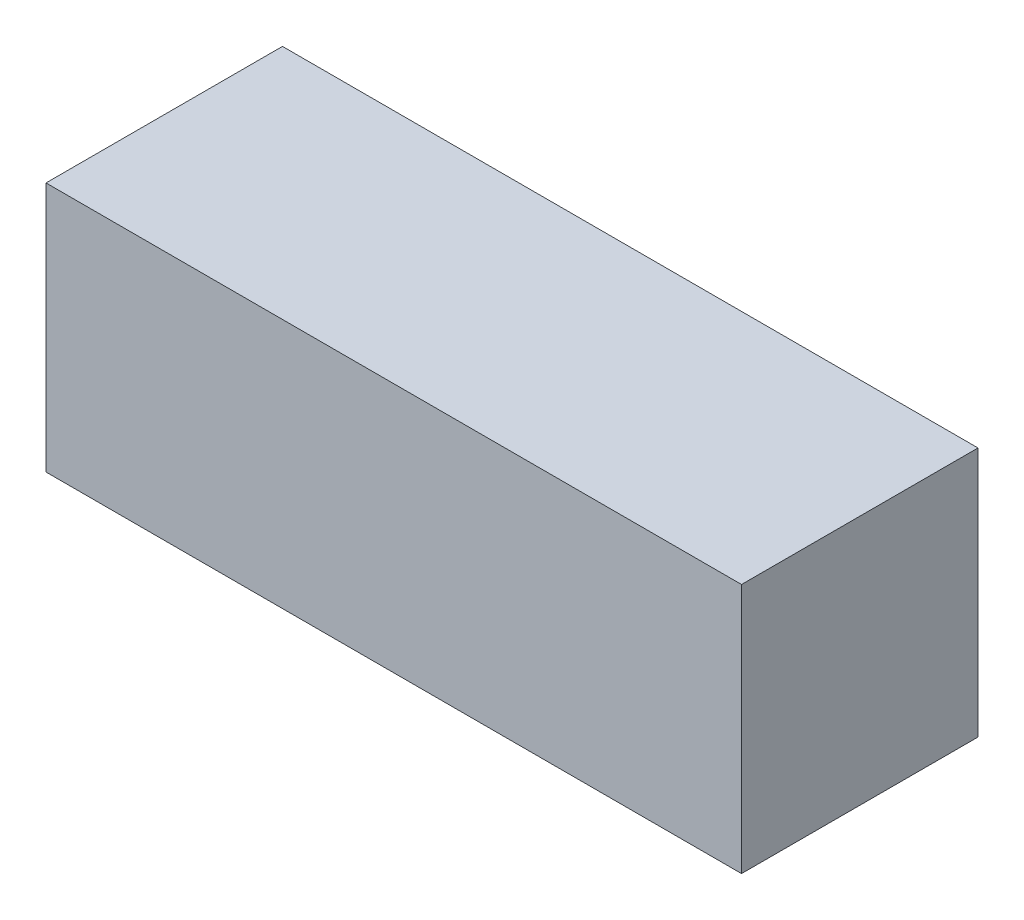
ISO-10303-21;
HEADER;
FILE_DESCRIPTION(('STEP AP214'),'2;1');
FILE_NAME('part.step','',(''),(''),'','','');
FILE_SCHEMA(('AUTOMOTIVE_DESIGN { 1 0 10303 214 1 1 1 1 }'));
ENDSEC;
DATA;
#1=APPLICATION_CONTEXT('core data for automotive mechanical design processes');
#2=APPLICATION_PROTOCOL_DEFINITION('international standard','automotive_design',2000,#1);
#3=PRODUCT_CONTEXT('',#1,'mechanical');
#4=PRODUCT('Part','Part','',(#3));
#5=PRODUCT_RELATED_PRODUCT_CATEGORY('part','',(#4));
#6=PRODUCT_DEFINITION_FORMATION('','',#4);
#7=PRODUCT_DEFINITION_CONTEXT('part definition',#1,'design');
#8=PRODUCT_DEFINITION('design','',#6,#7);
#9=PRODUCT_DEFINITION_SHAPE('','',#8);
#10=(LENGTH_UNIT() NAMED_UNIT(*) SI_UNIT(.MILLI.,.METRE.));
#11=(NAMED_UNIT(*) PLANE_ANGLE_UNIT() SI_UNIT($,.RADIAN.));
#12=(NAMED_UNIT(*) SI_UNIT($,.STERADIAN.) SOLID_ANGLE_UNIT());
#13=UNCERTAINTY_MEASURE_WITH_UNIT(LENGTH_MEASURE(1.E-05),#10,'distance_accuracy_value','');
#14=(GEOMETRIC_REPRESENTATION_CONTEXT(3) GLOBAL_UNCERTAINTY_ASSIGNED_CONTEXT((#13)) GLOBAL_UNIT_ASSIGNED_CONTEXT((#10,
#11,#12)) REPRESENTATION_CONTEXT('',''));
#15=CARTESIAN_POINT('',(0.,0.,0.));
#16=DIRECTION('',(0.,0.,1.));
#17=DIRECTION('',(1.,0.,0.));
#18=AXIS2_PLACEMENT_3D('',#15,#16,#17);
#19=CARTESIAN_POINT('',(635.,457.2,215.9));
#20=DIRECTION('',(-1.,0.,0.));
#21=DIRECTION('',(0.,0.,1.));
#22=AXIS2_PLACEMENT_3D('',#19,#20,#21);
#23=PLANE('',#22);
#24=DIRECTION('',(0.,0.,-1.));
#25=VECTOR('',#24,1.);
#26=CARTESIAN_POINT('',(635.,0.,215.9));
#27=LINE('',#26,#25);
#28=CARTESIAN_POINT('',(635.,0.,215.9));
#29=VERTEX_POINT('',#28);
#30=CARTESIAN_POINT('',(635.,0.,-215.9));
#31=VERTEX_POINT('',#30);
#32=EDGE_CURVE('E110',#29,#31,#27,.T.);
#33=ORIENTED_EDGE('',*,*,#32,.T.);
#34=DIRECTION('',(0.,-1.,0.));
#35=VECTOR('',#34,1.);
#36=CARTESIAN_POINT('',(635.,457.2,-215.9));
#37=LINE('',#36,#35);
#38=CARTESIAN_POINT('',(635.,457.2,-215.9));
#39=VERTEX_POINT('',#38);
#40=EDGE_CURVE('E11',#39,#31,#37,.T.);
#41=ORIENTED_EDGE('',*,*,#40,.F.);
#42=DIRECTION('',(0.,0.,-1.));
#43=VECTOR('',#42,1.);
#44=CARTESIAN_POINT('',(635.,457.2,215.9));
#45=LINE('',#44,#43);
#46=CARTESIAN_POINT('',(635.,457.2,215.9));
#47=VERTEX_POINT('',#46);
#48=EDGE_CURVE('E98',#47,#39,#45,.T.);
#49=ORIENTED_EDGE('',*,*,#48,.F.);
#50=DIRECTION('',(0.,-1.,0.));
#51=VECTOR('',#50,1.);
#52=CARTESIAN_POINT('',(635.,457.2,215.9));
#53=LINE('',#52,#51);
#54=EDGE_CURVE('E106',#47,#29,#53,.T.);
#55=ORIENTED_EDGE('',*,*,#54,.T.);
#56=EDGE_LOOP('',(#33,#41,#49,#55));
#57=FACE_BOUND('',#56,.T.);
#58=ADVANCED_FACE('F47',(#57),#23,.F.);
#59=CARTESIAN_POINT('',(-635.,457.2,-215.9));
#60=DIRECTION('',(0.,0.,1.));
#61=DIRECTION('',(1.,0.,0.));
#62=AXIS2_PLACEMENT_3D('',#59,#60,#61);
#63=PLANE('',#62);
#64=DIRECTION('',(-1.,0.,0.));
#65=VECTOR('',#64,1.);
#66=CARTESIAN_POINT('',(-635.,0.,-215.9));
#67=LINE('',#66,#65);
#68=CARTESIAN_POINT('',(-635.,0.,-215.9));
#69=VERTEX_POINT('',#68);
#70=EDGE_CURVE('E102',#31,#69,#67,.T.);
#71=ORIENTED_EDGE('',*,*,#70,.T.);
#72=DIRECTION('',(0.,-1.,0.));
#73=VECTOR('',#72,1.);
#74=CARTESIAN_POINT('',(-635.,457.2,-215.9));
#75=LINE('',#74,#73);
#76=CARTESIAN_POINT('',(-635.,457.2,-215.9));
#77=VERTEX_POINT('',#76);
#78=EDGE_CURVE('E55',#77,#69,#75,.T.);
#79=ORIENTED_EDGE('',*,*,#78,.F.);
#80=DIRECTION('',(-1.,0.,0.));
#81=VECTOR('',#80,1.);
#82=CARTESIAN_POINT('',(-635.,457.2,-215.9));
#83=LINE('',#82,#81);
#84=EDGE_CURVE('E93',#39,#77,#83,.T.);
#85=ORIENTED_EDGE('',*,*,#84,.F.);
#86=ORIENTED_EDGE('',*,*,#40,.T.);
#87=EDGE_LOOP('',(#71,#79,#85,#86));
#88=FACE_BOUND('',#87,.T.);
#89=ADVANCED_FACE('F101',(#88),#63,.F.);
#90=CARTESIAN_POINT('',(-635.,457.2,215.9));
#91=DIRECTION('',(1.,0.,0.));
#92=DIRECTION('',(0.,0.,-1.));
#93=AXIS2_PLACEMENT_3D('',#90,#91,#92);
#94=PLANE('',#93);
#95=DIRECTION('',(0.,0.,1.));
#96=VECTOR('',#95,1.);
#97=CARTESIAN_POINT('',(-635.,0.,215.9));
#98=LINE('',#97,#96);
#99=CARTESIAN_POINT('',(-635.,0.,215.9));
#100=VERTEX_POINT('',#99);
#101=EDGE_CURVE('E80',#69,#100,#98,.T.);
#102=ORIENTED_EDGE('',*,*,#101,.T.);
#103=DIRECTION('',(0.,-1.,0.));
#104=VECTOR('',#103,1.);
#105=CARTESIAN_POINT('',(-635.,457.2,215.9));
#106=LINE('',#105,#104);
#107=CARTESIAN_POINT('',(-635.,457.2,215.9));
#108=VERTEX_POINT('',#107);
#109=EDGE_CURVE('E103',#108,#100,#106,.T.);
#110=ORIENTED_EDGE('',*,*,#109,.F.);
#111=DIRECTION('',(0.,0.,1.));
#112=VECTOR('',#111,1.);
#113=CARTESIAN_POINT('',(-635.,457.2,215.9));
#114=LINE('',#113,#112);
#115=EDGE_CURVE('E96',#77,#108,#114,.T.);
#116=ORIENTED_EDGE('',*,*,#115,.F.);
#117=ORIENTED_EDGE('',*,*,#78,.T.);
#118=EDGE_LOOP('',(#102,#110,#116,#117));
#119=FACE_BOUND('',#118,.T.);
#120=ADVANCED_FACE('F104',(#119),#94,.F.);
#121=CARTESIAN_POINT('',(-635.,457.2,215.9));
#122=DIRECTION('',(0.,0.,-1.));
#123=DIRECTION('',(-1.,0.,0.));
#124=AXIS2_PLACEMENT_3D('',#121,#122,#123);
#125=PLANE('',#124);
#126=DIRECTION('',(1.,0.,0.));
#127=VECTOR('',#126,1.);
#128=CARTESIAN_POINT('',(-635.,0.,215.9));
#129=LINE('',#128,#127);
#130=EDGE_CURVE('E86',#100,#29,#129,.T.);
#131=ORIENTED_EDGE('',*,*,#130,.T.);
#132=ORIENTED_EDGE('',*,*,#54,.F.);
#133=DIRECTION('',(1.,0.,0.));
#134=VECTOR('',#133,1.);
#135=CARTESIAN_POINT('',(-635.,457.2,215.9));
#136=LINE('',#135,#134);
#137=EDGE_CURVE('E63',#108,#47,#136,.T.);
#138=ORIENTED_EDGE('',*,*,#137,.F.);
#139=ORIENTED_EDGE('',*,*,#109,.T.);
#140=EDGE_LOOP('',(#131,#132,#138,#139));
#141=FACE_BOUND('',#140,.T.);
#142=ADVANCED_FACE('F117',(#141),#125,.F.);
#143=CARTESIAN_POINT('',(0.,457.2,0.));
#144=DIRECTION('',(0.,-1.,0.));
#145=DIRECTION('',(0.,0.,-1.));
#146=AXIS2_PLACEMENT_3D('',#143,#144,#145);
#147=PLANE('',#146);
#148=ORIENTED_EDGE('',*,*,#48,.T.);
#149=ORIENTED_EDGE('',*,*,#84,.T.);
#150=ORIENTED_EDGE('',*,*,#115,.T.);
#151=ORIENTED_EDGE('',*,*,#137,.T.);
#152=EDGE_LOOP('',(#148,#149,#150,#151));
#153=FACE_BOUND('',#152,.T.);
#154=ADVANCED_FACE('F94',(#153),#147,.F.);
#155=CARTESIAN_POINT('',(0.,0.,0.));
#156=DIRECTION('',(0.,-1.,0.));
#157=DIRECTION('',(0.,0.,-1.));
#158=AXIS2_PLACEMENT_3D('',#155,#156,#157);
#159=PLANE('',#158);
#160=ORIENTED_EDGE('',*,*,#32,.F.);
#161=ORIENTED_EDGE('',*,*,#130,.F.);
#162=ORIENTED_EDGE('',*,*,#101,.F.);
#163=ORIENTED_EDGE('',*,*,#70,.F.);
#164=EDGE_LOOP('',(#160,#161,#162,#163));
#165=FACE_BOUND('',#164,.T.);
#166=ADVANCED_FACE('F120',(#165),#159,.T.);
#167=CLOSED_SHELL('',(#58,#89,#120,#142,#154,#166));
#168=MANIFOLD_SOLID_BREP('B2',#167);
#169=ADVANCED_BREP_SHAPE_REPRESENTATION('',(#18,#168),#14);
#170=SHAPE_DEFINITION_REPRESENTATION(#9,#169);
ENDSEC;
END-ISO-10303-21;
